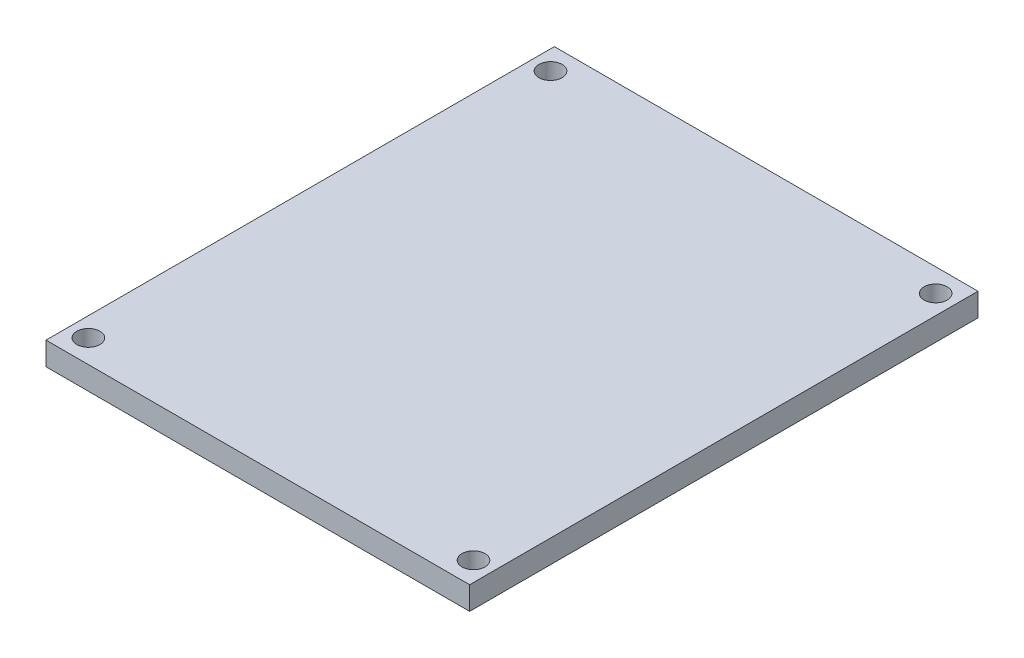
ISO-10303-21;
HEADER;
FILE_DESCRIPTION(('STEP AP214'),'2;1');
FILE_NAME('part.step','',(''),(''),'','','');
FILE_SCHEMA(('AUTOMOTIVE_DESIGN { 1 0 10303 214 1 1 1 1 }'));
ENDSEC;
DATA;
#1=APPLICATION_CONTEXT('core data for automotive mechanical design processes');
#2=APPLICATION_PROTOCOL_DEFINITION('international standard','automotive_design',2000,#1);
#3=PRODUCT_CONTEXT('',#1,'mechanical');
#4=PRODUCT('Part','Part','',(#3));
#5=PRODUCT_RELATED_PRODUCT_CATEGORY('part','',(#4));
#6=PRODUCT_DEFINITION_FORMATION('','',#4);
#7=PRODUCT_DEFINITION_CONTEXT('part definition',#1,'design');
#8=PRODUCT_DEFINITION('design','',#6,#7);
#9=PRODUCT_DEFINITION_SHAPE('','',#8);
#10=(LENGTH_UNIT() NAMED_UNIT(*) SI_UNIT(.MILLI.,.METRE.));
#11=(NAMED_UNIT(*) PLANE_ANGLE_UNIT() SI_UNIT($,.RADIAN.));
#12=(NAMED_UNIT(*) SI_UNIT($,.STERADIAN.) SOLID_ANGLE_UNIT());
#13=UNCERTAINTY_MEASURE_WITH_UNIT(LENGTH_MEASURE(1.E-05),#10,'distance_accuracy_value','');
#14=(GEOMETRIC_REPRESENTATION_CONTEXT(3) GLOBAL_UNCERTAINTY_ASSIGNED_CONTEXT((#13)) GLOBAL_UNIT_ASSIGNED_CONTEXT((#10,
#11,#12)) REPRESENTATION_CONTEXT('',''));
#15=CARTESIAN_POINT('',(0.,0.,0.));
#16=DIRECTION('',(0.,0.,1.));
#17=DIRECTION('',(1.,0.,0.));
#18=AXIS2_PLACEMENT_3D('',#15,#16,#17);
#19=CARTESIAN_POINT('',(0.,3.,0.));
#20=DIRECTION('',(0.,-1.,0.));
#21=DIRECTION('',(0.,0.,-1.));
#22=AXIS2_PLACEMENT_3D('',#19,#20,#21);
#23=PLANE('',#22);
#24=DIRECTION('',(0.,0.,-1.));
#25=VECTOR('',#24,1.);
#26=CARTESIAN_POINT('',(27.5,3.,33.));
#27=LINE('',#26,#25);
#28=CARTESIAN_POINT('',(27.5,3.,33.));
#29=VERTEX_POINT('',#28);
#30=CARTESIAN_POINT('',(27.5,3.,-33.));
#31=VERTEX_POINT('',#30);
#32=EDGE_CURVE('E85',#29,#31,#27,.T.);
#33=ORIENTED_EDGE('',*,*,#32,.T.);
#34=DIRECTION('',(-1.,0.,0.));
#35=VECTOR('',#34,1.);
#36=CARTESIAN_POINT('',(-27.5,3.,-33.));
#37=LINE('',#36,#35);
#38=CARTESIAN_POINT('',(-27.5,3.,-33.));
#39=VERTEX_POINT('',#38);
#40=EDGE_CURVE('E80',#31,#39,#37,.T.);
#41=ORIENTED_EDGE('',*,*,#40,.T.);
#42=DIRECTION('',(0.,0.,1.));
#43=VECTOR('',#42,1.);
#44=CARTESIAN_POINT('',(-27.5,3.,33.));
#45=LINE('',#44,#43);
#46=CARTESIAN_POINT('',(-27.5,3.,33.));
#47=VERTEX_POINT('',#46);
#48=EDGE_CURVE('E83',#39,#47,#45,.T.);
#49=ORIENTED_EDGE('',*,*,#48,.T.);
#50=DIRECTION('',(1.,0.,0.));
#51=VECTOR('',#50,1.);
#52=CARTESIAN_POINT('',(-27.5,3.,33.));
#53=LINE('',#52,#51);
#54=EDGE_CURVE('E50',#47,#29,#53,.T.);
#55=ORIENTED_EDGE('',*,*,#54,.T.);
#56=EDGE_LOOP('',(#33,#41,#49,#55));
#57=FACE_BOUND('',#56,.T.);
#58=CARTESIAN_POINT('',(-25.,3.,-30.));
#59=DIRECTION('',(0.,1.,0.));
#60=DIRECTION('',(0.,0.,1.));
#61=AXIS2_PLACEMENT_3D('',#58,#59,#60);
#62=CIRCLE('',#61,1.5);
#63=CARTESIAN_POINT('',(-25.,3.,-28.5));
#64=VERTEX_POINT('',#63);
#65=EDGE_CURVE('E100',#64,#64,#62,.T.);
#66=ORIENTED_EDGE('',*,*,#65,.F.);
#67=EDGE_LOOP('',(#66));
#68=FACE_BOUND('',#67,.T.);
#69=CARTESIAN_POINT('',(25.,3.,-30.));
#70=DIRECTION('',(0.,1.,0.));
#71=DIRECTION('',(0.,0.,1.));
#72=AXIS2_PLACEMENT_3D('',#69,#70,#71);
#73=CIRCLE('',#72,1.5);
#74=CARTESIAN_POINT('',(25.,3.,-28.5));
#75=VERTEX_POINT('',#74);
#76=EDGE_CURVE('E115',#75,#75,#73,.T.);
#77=ORIENTED_EDGE('',*,*,#76,.F.);
#78=EDGE_LOOP('',(#77));
#79=FACE_BOUND('',#78,.T.);
#80=CARTESIAN_POINT('',(25.,3.,30.));
#81=DIRECTION('',(0.,1.,0.));
#82=DIRECTION('',(0.,0.,1.));
#83=AXIS2_PLACEMENT_3D('',#80,#81,#82);
#84=CIRCLE('',#83,1.5);
#85=CARTESIAN_POINT('',(25.,3.,31.5));
#86=VERTEX_POINT('',#85);
#87=EDGE_CURVE('E121',#86,#86,#84,.T.);
#88=ORIENTED_EDGE('',*,*,#87,.F.);
#89=EDGE_LOOP('',(#88));
#90=FACE_BOUND('',#89,.T.);
#91=CARTESIAN_POINT('',(-25.,3.,30.));
#92=DIRECTION('',(0.,1.,0.));
#93=DIRECTION('',(0.,0.,1.));
#94=AXIS2_PLACEMENT_3D('',#91,#92,#93);
#95=CIRCLE('',#94,1.5);
#96=CARTESIAN_POINT('',(-25.,3.,31.5));
#97=VERTEX_POINT('',#96);
#98=EDGE_CURVE('E127',#97,#97,#95,.T.);
#99=ORIENTED_EDGE('',*,*,#98,.F.);
#100=EDGE_LOOP('',(#99));
#101=FACE_BOUND('',#100,.T.);
#102=ADVANCED_FACE('F33',(#57,#68,#79,#90,#101),#23,.F.);
#103=CARTESIAN_POINT('',(0.,0.,0.));
#104=DIRECTION('',(0.,-1.,0.));
#105=DIRECTION('',(0.,0.,-1.));
#106=AXIS2_PLACEMENT_3D('',#103,#104,#105);
#107=PLANE('',#106);
#108=CARTESIAN_POINT('',(25.,0.,30.));
#109=DIRECTION('',(0.,1.,0.));
#110=DIRECTION('',(0.,0.,1.));
#111=AXIS2_PLACEMENT_3D('',#108,#109,#110);
#112=CIRCLE('',#111,1.5);
#113=CARTESIAN_POINT('',(25.,0.,31.5));
#114=VERTEX_POINT('',#113);
#115=EDGE_CURVE('E124',#114,#114,#112,.T.);
#116=ORIENTED_EDGE('',*,*,#115,.T.);
#117=EDGE_LOOP('',(#116));
#118=FACE_BOUND('',#117,.T.);
#119=CARTESIAN_POINT('',(-25.,0.,-30.));
#120=DIRECTION('',(0.,1.,0.));
#121=DIRECTION('',(0.,0.,1.));
#122=AXIS2_PLACEMENT_3D('',#119,#120,#121);
#123=CIRCLE('',#122,1.5);
#124=CARTESIAN_POINT('',(-25.,0.,-28.5));
#125=VERTEX_POINT('',#124);
#126=EDGE_CURVE('E112',#125,#125,#123,.T.);
#127=ORIENTED_EDGE('',*,*,#126,.T.);
#128=EDGE_LOOP('',(#127));
#129=FACE_BOUND('',#128,.T.);
#130=DIRECTION('',(0.,0.,-1.));
#131=VECTOR('',#130,1.);
#132=CARTESIAN_POINT('',(27.5,0.,33.));
#133=LINE('',#132,#131);
#134=CARTESIAN_POINT('',(27.5,0.,33.));
#135=VERTEX_POINT('',#134);
#136=CARTESIAN_POINT('',(27.5,0.,-33.));
#137=VERTEX_POINT('',#136);
#138=EDGE_CURVE('E97',#135,#137,#133,.T.);
#139=ORIENTED_EDGE('',*,*,#138,.F.);
#140=DIRECTION('',(1.,0.,0.));
#141=VECTOR('',#140,1.);
#142=CARTESIAN_POINT('',(-27.5,0.,33.));
#143=LINE('',#142,#141);
#144=CARTESIAN_POINT('',(-27.5,0.,33.));
#145=VERTEX_POINT('',#144);
#146=EDGE_CURVE('E73',#145,#135,#143,.T.);
#147=ORIENTED_EDGE('',*,*,#146,.F.);
#148=DIRECTION('',(0.,0.,1.));
#149=VECTOR('',#148,1.);
#150=CARTESIAN_POINT('',(-27.5,0.,33.));
#151=LINE('',#150,#149);
#152=CARTESIAN_POINT('',(-27.5,0.,-33.));
#153=VERTEX_POINT('',#152);
#154=EDGE_CURVE('E67',#153,#145,#151,.T.);
#155=ORIENTED_EDGE('',*,*,#154,.F.);
#156=DIRECTION('',(-1.,0.,0.));
#157=VECTOR('',#156,1.);
#158=CARTESIAN_POINT('',(-27.5,0.,-33.));
#159=LINE('',#158,#157);
#160=EDGE_CURVE('E89',#137,#153,#159,.T.);
#161=ORIENTED_EDGE('',*,*,#160,.F.);
#162=EDGE_LOOP('',(#139,#147,#155,#161));
#163=FACE_BOUND('',#162,.T.);
#164=CARTESIAN_POINT('',(25.,0.,-30.));
#165=DIRECTION('',(0.,1.,0.));
#166=DIRECTION('',(0.,0.,1.));
#167=AXIS2_PLACEMENT_3D('',#164,#165,#166);
#168=CIRCLE('',#167,1.5);
#169=CARTESIAN_POINT('',(25.,0.,-28.5));
#170=VERTEX_POINT('',#169);
#171=EDGE_CURVE('E118',#170,#170,#168,.T.);
#172=ORIENTED_EDGE('',*,*,#171,.T.);
#173=EDGE_LOOP('',(#172));
#174=FACE_BOUND('',#173,.T.);
#175=CARTESIAN_POINT('',(-25.,0.,30.));
#176=DIRECTION('',(0.,1.,0.));
#177=DIRECTION('',(0.,0.,1.));
#178=AXIS2_PLACEMENT_3D('',#175,#176,#177);
#179=CIRCLE('',#178,1.5);
#180=CARTESIAN_POINT('',(-25.,0.,31.5));
#181=VERTEX_POINT('',#180);
#182=EDGE_CURVE('E130',#181,#181,#179,.T.);
#183=ORIENTED_EDGE('',*,*,#182,.T.);
#184=EDGE_LOOP('',(#183));
#185=FACE_BOUND('',#184,.T.);
#186=ADVANCED_FACE('F108',(#118,#129,#163,#174,#185),#107,.T.);
#187=CARTESIAN_POINT('',(27.5,3.,33.));
#188=DIRECTION('',(-1.,0.,0.));
#189=DIRECTION('',(0.,0.,1.));
#190=AXIS2_PLACEMENT_3D('',#187,#188,#189);
#191=PLANE('',#190);
#192=ORIENTED_EDGE('',*,*,#138,.T.);
#193=DIRECTION('',(0.,-1.,0.));
#194=VECTOR('',#193,1.);
#195=CARTESIAN_POINT('',(27.5,3.,-33.));
#196=LINE('',#195,#194);
#197=EDGE_CURVE('E11',#31,#137,#196,.T.);
#198=ORIENTED_EDGE('',*,*,#197,.F.);
#199=ORIENTED_EDGE('',*,*,#32,.F.);
#200=DIRECTION('',(0.,-1.,0.));
#201=VECTOR('',#200,1.);
#202=CARTESIAN_POINT('',(27.5,3.,33.));
#203=LINE('',#202,#201);
#204=EDGE_CURVE('E93',#29,#135,#203,.T.);
#205=ORIENTED_EDGE('',*,*,#204,.T.);
#206=EDGE_LOOP('',(#192,#198,#199,#205));
#207=FACE_BOUND('',#206,.T.);
#208=ADVANCED_FACE('F35',(#207),#191,.F.);
#209=CARTESIAN_POINT('',(-27.5,3.,-33.));
#210=DIRECTION('',(0.,0.,1.));
#211=DIRECTION('',(1.,0.,0.));
#212=AXIS2_PLACEMENT_3D('',#209,#210,#211);
#213=PLANE('',#212);
#214=ORIENTED_EDGE('',*,*,#160,.T.);
#215=DIRECTION('',(0.,-1.,0.));
#216=VECTOR('',#215,1.);
#217=CARTESIAN_POINT('',(-27.5,3.,-33.));
#218=LINE('',#217,#216);
#219=EDGE_CURVE('E42',#39,#153,#218,.T.);
#220=ORIENTED_EDGE('',*,*,#219,.F.);
#221=ORIENTED_EDGE('',*,*,#40,.F.);
#222=ORIENTED_EDGE('',*,*,#197,.T.);
#223=EDGE_LOOP('',(#214,#220,#221,#222));
#224=FACE_BOUND('',#223,.T.);
#225=ADVANCED_FACE('F88',(#224),#213,.F.);
#226=CARTESIAN_POINT('',(-27.5,3.,33.));
#227=DIRECTION('',(1.,0.,0.));
#228=DIRECTION('',(0.,0.,-1.));
#229=AXIS2_PLACEMENT_3D('',#226,#227,#228);
#230=PLANE('',#229);
#231=ORIENTED_EDGE('',*,*,#154,.T.);
#232=DIRECTION('',(0.,-1.,0.));
#233=VECTOR('',#232,1.);
#234=CARTESIAN_POINT('',(-27.5,3.,33.));
#235=LINE('',#234,#233);
#236=EDGE_CURVE('E90',#47,#145,#235,.T.);
#237=ORIENTED_EDGE('',*,*,#236,.F.);
#238=ORIENTED_EDGE('',*,*,#48,.F.);
#239=ORIENTED_EDGE('',*,*,#219,.T.);
#240=EDGE_LOOP('',(#231,#237,#238,#239));
#241=FACE_BOUND('',#240,.T.);
#242=ADVANCED_FACE('F91',(#241),#230,.F.);
#243=CARTESIAN_POINT('',(-27.5,3.,33.));
#244=DIRECTION('',(0.,0.,-1.));
#245=DIRECTION('',(-1.,0.,0.));
#246=AXIS2_PLACEMENT_3D('',#243,#244,#245);
#247=PLANE('',#246);
#248=ORIENTED_EDGE('',*,*,#146,.T.);
#249=ORIENTED_EDGE('',*,*,#204,.F.);
#250=ORIENTED_EDGE('',*,*,#54,.F.);
#251=ORIENTED_EDGE('',*,*,#236,.T.);
#252=EDGE_LOOP('',(#248,#249,#250,#251));
#253=FACE_BOUND('',#252,.T.);
#254=ADVANCED_FACE('F105',(#253),#247,.F.);
#255=CARTESIAN_POINT('',(-25.,3.,-30.));
#256=DIRECTION('',(0.,-1.,0.));
#257=DIRECTION('',(0.,0.,-1.));
#258=AXIS2_PLACEMENT_3D('',#255,#256,#257);
#259=CYLINDRICAL_SURFACE('',#258,1.5);
#260=ORIENTED_EDGE('',*,*,#65,.T.);
#261=EDGE_LOOP('',(#260));
#262=FACE_BOUND('',#261,.T.);
#263=ORIENTED_EDGE('',*,*,#126,.F.);
#264=EDGE_LOOP('',(#263));
#265=FACE_BOUND('',#264,.T.);
#266=ADVANCED_FACE('F147',(#262,#265),#259,.F.);
#267=CARTESIAN_POINT('',(25.,3.,-30.));
#268=DIRECTION('',(0.,-1.,0.));
#269=DIRECTION('',(0.,0.,-1.));
#270=AXIS2_PLACEMENT_3D('',#267,#268,#269);
#271=CYLINDRICAL_SURFACE('',#270,1.5);
#272=ORIENTED_EDGE('',*,*,#76,.T.);
#273=EDGE_LOOP('',(#272));
#274=FACE_BOUND('',#273,.T.);
#275=ORIENTED_EDGE('',*,*,#171,.F.);
#276=EDGE_LOOP('',(#275));
#277=FACE_BOUND('',#276,.T.);
#278=ADVANCED_FACE('F193',(#274,#277),#271,.F.);
#279=CARTESIAN_POINT('',(25.,3.,30.));
#280=DIRECTION('',(0.,-1.,0.));
#281=DIRECTION('',(0.,0.,-1.));
#282=AXIS2_PLACEMENT_3D('',#279,#280,#281);
#283=CYLINDRICAL_SURFACE('',#282,1.5);
#284=ORIENTED_EDGE('',*,*,#87,.T.);
#285=EDGE_LOOP('',(#284));
#286=FACE_BOUND('',#285,.T.);
#287=ORIENTED_EDGE('',*,*,#115,.F.);
#288=EDGE_LOOP('',(#287));
#289=FACE_BOUND('',#288,.T.);
#290=ADVANCED_FACE('F201',(#286,#289),#283,.F.);
#291=CARTESIAN_POINT('',(-25.,3.,30.));
#292=DIRECTION('',(0.,-1.,0.));
#293=DIRECTION('',(0.,0.,-1.));
#294=AXIS2_PLACEMENT_3D('',#291,#292,#293);
#295=CYLINDRICAL_SURFACE('',#294,1.5);
#296=ORIENTED_EDGE('',*,*,#98,.T.);
#297=EDGE_LOOP('',(#296));
#298=FACE_BOUND('',#297,.T.);
#299=ORIENTED_EDGE('',*,*,#182,.F.);
#300=EDGE_LOOP('',(#299));
#301=FACE_BOUND('',#300,.T.);
#302=ADVANCED_FACE('F136',(#298,#301),#295,.F.);
#303=CLOSED_SHELL('',(#102,#186,#208,#225,#242,#254,#266,#278,#290,#302));
#304=MANIFOLD_SOLID_BREP('B2',#303);
#305=ADVANCED_BREP_SHAPE_REPRESENTATION('',(#18,#304),#14);
#306=SHAPE_DEFINITION_REPRESENTATION(#9,#305);
ENDSEC;
END-ISO-10303-21;
